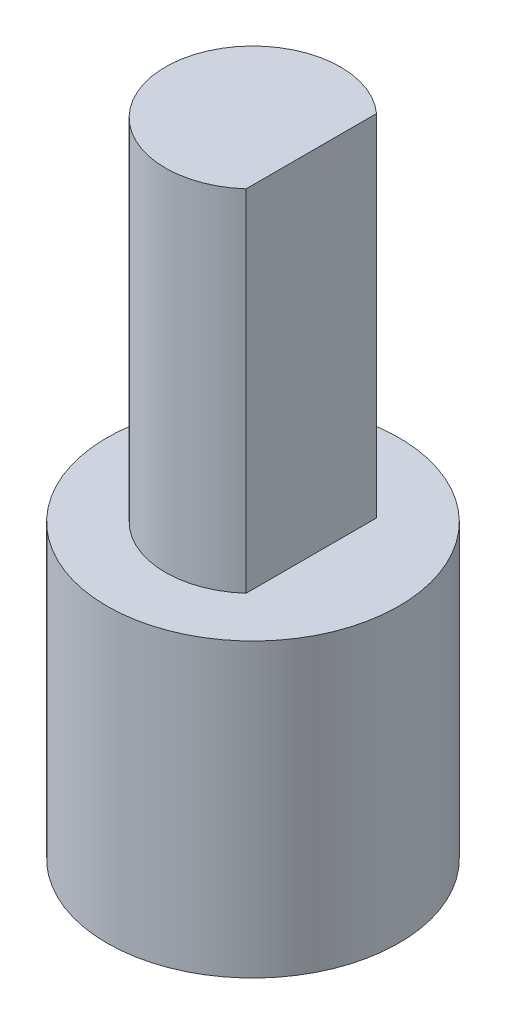
ISO-10303-21;
HEADER;
FILE_DESCRIPTION(('STEP AP214'),'2;1');
FILE_NAME('part.step','',(''),(''),'','','');
FILE_SCHEMA(('AUTOMOTIVE_DESIGN { 1 0 10303 214 1 1 1 1 }'));
ENDSEC;
DATA;
#1=APPLICATION_CONTEXT('core data for automotive mechanical design processes');
#2=APPLICATION_PROTOCOL_DEFINITION('international standard','automotive_design',2000,#1);
#3=PRODUCT_CONTEXT('',#1,'mechanical');
#4=PRODUCT('Part','Part','',(#3));
#5=PRODUCT_RELATED_PRODUCT_CATEGORY('part','',(#4));
#6=PRODUCT_DEFINITION_FORMATION('','',#4);
#7=PRODUCT_DEFINITION_CONTEXT('part definition',#1,'design');
#8=PRODUCT_DEFINITION('design','',#6,#7);
#9=PRODUCT_DEFINITION_SHAPE('','',#8);
#10=(LENGTH_UNIT() NAMED_UNIT(*) SI_UNIT(.MILLI.,.METRE.));
#11=(NAMED_UNIT(*) PLANE_ANGLE_UNIT() SI_UNIT($,.RADIAN.));
#12=(NAMED_UNIT(*) SI_UNIT($,.STERADIAN.) SOLID_ANGLE_UNIT());
#13=UNCERTAINTY_MEASURE_WITH_UNIT(LENGTH_MEASURE(1.E-05),#10,'distance_accuracy_value','');
#14=(GEOMETRIC_REPRESENTATION_CONTEXT(3) GLOBAL_UNCERTAINTY_ASSIGNED_CONTEXT((#13)) GLOBAL_UNIT_ASSIGNED_CONTEXT((#10,
#11,#12)) REPRESENTATION_CONTEXT('',''));
#15=CARTESIAN_POINT('',(0.,0.,0.));
#16=DIRECTION('',(0.,0.,1.));
#17=DIRECTION('',(1.,0.,0.));
#18=AXIS2_PLACEMENT_3D('',#15,#16,#17);
#19=CARTESIAN_POINT('',(0.,5.,0.));
#20=DIRECTION('',(0.,-1.,0.));
#21=DIRECTION('',(0.,0.,-1.));
#22=AXIS2_PLACEMENT_3D('',#19,#20,#21);
#23=CYLINDRICAL_SURFACE('',#22,2.5);
#24=CARTESIAN_POINT('',(0.,5.,0.));
#25=DIRECTION('',(0.,1.,0.));
#26=DIRECTION('',(0.,0.,1.));
#27=AXIS2_PLACEMENT_3D('',#24,#25,#26);
#28=CIRCLE('',#27,2.5);
#29=CARTESIAN_POINT('',(0.,5.,2.5));
#30=VERTEX_POINT('',#29);
#31=EDGE_CURVE('E11',#30,#30,#28,.T.);
#32=ORIENTED_EDGE('',*,*,#31,.F.);
#33=EDGE_LOOP('',(#32));
#34=FACE_BOUND('',#33,.T.);
#35=CARTESIAN_POINT('',(0.,0.,0.));
#36=DIRECTION('',(0.,1.,0.));
#37=DIRECTION('',(0.,0.,1.));
#38=AXIS2_PLACEMENT_3D('',#35,#36,#37);
#39=CIRCLE('',#38,2.5);
#40=CARTESIAN_POINT('',(0.,0.,2.5));
#41=VERTEX_POINT('',#40);
#42=EDGE_CURVE('E39',#41,#41,#39,.T.);
#43=ORIENTED_EDGE('',*,*,#42,.T.);
#44=EDGE_LOOP('',(#43));
#45=FACE_BOUND('',#44,.T.);
#46=ADVANCED_FACE('F36',(#34,#45),#23,.T.);
#47=CARTESIAN_POINT('',(0.,5.,0.));
#48=DIRECTION('',(0.,1.,0.));
#49=DIRECTION('',(0.,0.,1.));
#50=AXIS2_PLACEMENT_3D('',#47,#48,#49);
#51=PLANE('',#50);
#52=CARTESIAN_POINT('',(0.,5.,0.));
#53=DIRECTION('',(0.,1.,0.));
#54=DIRECTION('',(0.,0.,-1.));
#55=AXIS2_PLACEMENT_3D('',#52,#53,#54);
#56=CIRCLE('',#55,1.5);
#57=CARTESIAN_POINT('',(1.,5.,-1.1180339887499));
#58=VERTEX_POINT('',#57);
#59=CARTESIAN_POINT('',(1.,5.,1.1180339887499));
#60=VERTEX_POINT('',#59);
#61=EDGE_CURVE('E62',#58,#60,#56,.T.);
#62=ORIENTED_EDGE('',*,*,#61,.F.);
#63=DIRECTION('',(0.,0.,-1.));
#64=VECTOR('',#63,1.);
#65=CARTESIAN_POINT('',(1.,5.,-1.1180339887499));
#66=LINE('',#65,#64);
#67=EDGE_CURVE('E49',#60,#58,#66,.T.);
#68=ORIENTED_EDGE('',*,*,#67,.F.);
#69=EDGE_LOOP('',(#62,#68));
#70=FACE_BOUND('',#69,.T.);
#71=ORIENTED_EDGE('',*,*,#31,.T.);
#72=EDGE_LOOP('',(#71));
#73=FACE_BOUND('',#72,.T.);
#74=ADVANCED_FACE('F63',(#70,#73),#51,.T.);
#75=CARTESIAN_POINT('',(0.,0.,0.));
#76=DIRECTION('',(0.,1.,0.));
#77=DIRECTION('',(0.,0.,1.));
#78=AXIS2_PLACEMENT_3D('',#75,#76,#77);
#79=PLANE('',#78);
#80=ORIENTED_EDGE('',*,*,#42,.F.);
#81=EDGE_LOOP('',(#80));
#82=FACE_BOUND('',#81,.T.);
#83=ADVANCED_FACE('F93',(#82),#79,.F.);
#84=CARTESIAN_POINT('',(0.,11.,0.));
#85=DIRECTION('',(0.,-1.,0.));
#86=DIRECTION('',(0.,0.,-1.));
#87=AXIS2_PLACEMENT_3D('',#84,#85,#86);
#88=CYLINDRICAL_SURFACE('',#87,1.5);
#89=ORIENTED_EDGE('',*,*,#61,.T.);
#90=DIRECTION('',(0.,-1.,0.));
#91=VECTOR('',#90,1.);
#92=CARTESIAN_POINT('',(1.,11.,1.1180339887499));
#93=LINE('',#92,#91);
#94=CARTESIAN_POINT('',(1.,11.,1.1180339887499));
#95=VERTEX_POINT('',#94);
#96=EDGE_CURVE('E73',#95,#60,#93,.T.);
#97=ORIENTED_EDGE('',*,*,#96,.F.);
#98=CARTESIAN_POINT('',(0.,11.,0.));
#99=DIRECTION('',(0.,1.,0.));
#100=DIRECTION('',(0.,0.,-1.));
#101=AXIS2_PLACEMENT_3D('',#98,#99,#100);
#102=CIRCLE('',#101,1.5);
#103=CARTESIAN_POINT('',(1.,11.,-1.1180339887499));
#104=VERTEX_POINT('',#103);
#105=EDGE_CURVE('E74',#104,#95,#102,.T.);
#106=ORIENTED_EDGE('',*,*,#105,.F.);
#107=DIRECTION('',(0.,-1.,0.));
#108=VECTOR('',#107,1.);
#109=CARTESIAN_POINT('',(1.,11.,-1.1180339887499));
#110=LINE('',#109,#108);
#111=EDGE_CURVE('E71',#104,#58,#110,.T.);
#112=ORIENTED_EDGE('',*,*,#111,.T.);
#113=EDGE_LOOP('',(#89,#97,#106,#112));
#114=FACE_BOUND('',#113,.T.);
#115=ADVANCED_FACE('F76',(#114),#88,.T.);
#116=CARTESIAN_POINT('',(1.,11.,-1.1180339887499));
#117=DIRECTION('',(-1.,0.,0.));
#118=DIRECTION('',(0.,0.,1.));
#119=AXIS2_PLACEMENT_3D('',#116,#117,#118);
#120=PLANE('',#119);
#121=ORIENTED_EDGE('',*,*,#67,.T.);
#122=ORIENTED_EDGE('',*,*,#111,.F.);
#123=DIRECTION('',(0.,0.,-1.));
#124=VECTOR('',#123,1.);
#125=CARTESIAN_POINT('',(1.,11.,-1.1180339887499));
#126=LINE('',#125,#124);
#127=EDGE_CURVE('E57',#95,#104,#126,.T.);
#128=ORIENTED_EDGE('',*,*,#127,.F.);
#129=ORIENTED_EDGE('',*,*,#96,.T.);
#130=EDGE_LOOP('',(#121,#122,#128,#129));
#131=FACE_BOUND('',#130,.T.);
#132=ADVANCED_FACE('F70',(#131),#120,.F.);
#133=CARTESIAN_POINT('',(0.,11.,0.));
#134=DIRECTION('',(0.,-1.,0.));
#135=DIRECTION('',(0.,0.,-1.));
#136=AXIS2_PLACEMENT_3D('',#133,#134,#135);
#137=PLANE('',#136);
#138=ORIENTED_EDGE('',*,*,#105,.T.);
#139=ORIENTED_EDGE('',*,*,#127,.T.);
#140=EDGE_LOOP('',(#138,#139));
#141=FACE_BOUND('',#140,.T.);
#142=ADVANCED_FACE('F81',(#141),#137,.F.);
#143=CLOSED_SHELL('',(#46,#74,#83,#115,#132,#142));
#144=MANIFOLD_SOLID_BREP('B2',#143);
#145=ADVANCED_BREP_SHAPE_REPRESENTATION('',(#18,#144),#14);
#146=SHAPE_DEFINITION_REPRESENTATION(#9,#145);
ENDSEC;
END-ISO-10303-21;
